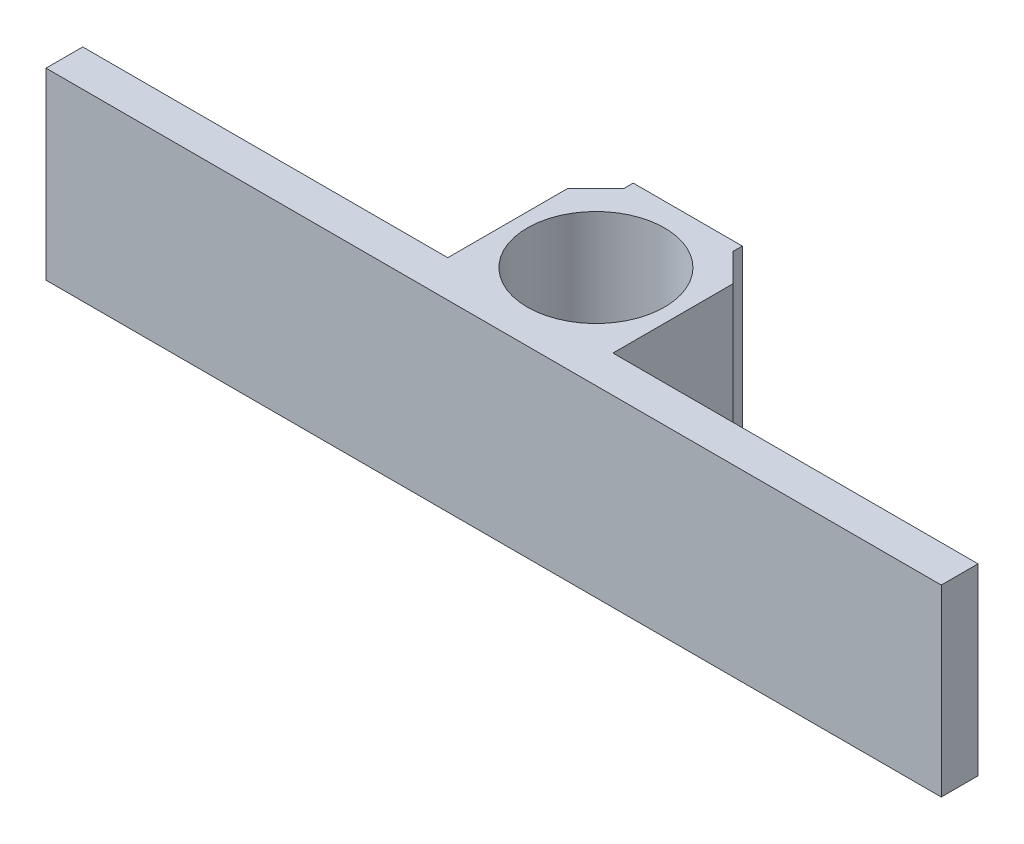
ISO-10303-21;
HEADER;
FILE_DESCRIPTION(('STEP AP214'),'2;1');
FILE_NAME('part.step','',(''),(''),'','','');
FILE_SCHEMA(('AUTOMOTIVE_DESIGN { 1 0 10303 214 1 1 1 1 }'));
ENDSEC;
DATA;
#1=APPLICATION_CONTEXT('core data for automotive mechanical design processes');
#2=APPLICATION_PROTOCOL_DEFINITION('international standard','automotive_design',2000,#1);
#3=PRODUCT_CONTEXT('',#1,'mechanical');
#4=PRODUCT('Part','Part','',(#3));
#5=PRODUCT_RELATED_PRODUCT_CATEGORY('part','',(#4));
#6=PRODUCT_DEFINITION_FORMATION('','',#4);
#7=PRODUCT_DEFINITION_CONTEXT('part definition',#1,'design');
#8=PRODUCT_DEFINITION('design','',#6,#7);
#9=PRODUCT_DEFINITION_SHAPE('','',#8);
#10=(LENGTH_UNIT() NAMED_UNIT(*) SI_UNIT(.MILLI.,.METRE.));
#11=(NAMED_UNIT(*) PLANE_ANGLE_UNIT() SI_UNIT($,.RADIAN.));
#12=(NAMED_UNIT(*) SI_UNIT($,.STERADIAN.) SOLID_ANGLE_UNIT());
#13=UNCERTAINTY_MEASURE_WITH_UNIT(LENGTH_MEASURE(1.E-05),#10,'distance_accuracy_value','');
#14=(GEOMETRIC_REPRESENTATION_CONTEXT(3) GLOBAL_UNCERTAINTY_ASSIGNED_CONTEXT((#13)) GLOBAL_UNIT_ASSIGNED_CONTEXT((#10,
#11,#12)) REPRESENTATION_CONTEXT('',''));
#15=CARTESIAN_POINT('',(0.,0.,0.));
#16=DIRECTION('',(0.,0.,1.));
#17=DIRECTION('',(1.,0.,0.));
#18=AXIS2_PLACEMENT_3D('',#15,#16,#17);
#19=CARTESIAN_POINT('',(0.,0.,0.));
#20=DIRECTION('',(0.,0.,1.));
#21=DIRECTION('',(1.,0.,0.));
#22=AXIS2_PLACEMENT_3D('',#19,#20,#21);
#23=PLANE('',#22);
#24=DIRECTION('',(-1.,0.,0.));
#25=VECTOR('',#24,1.);
#26=CARTESIAN_POINT('',(-151.290601160674,21.7469632794638,0.));
#27=LINE('',#26,#25);
#28=CARTESIAN_POINT('',(-50.3115162557315,21.7469632794638,0.));
#29=VERTEX_POINT('',#28);
#30=CARTESIAN_POINT('',(-151.290601160674,21.7469632794638,0.));
#31=VERTEX_POINT('',#30);
#32=EDGE_CURVE('E397',#29,#31,#27,.T.);
#33=ORIENTED_EDGE('',*,*,#32,.F.);
#34=DIRECTION('',(0.,1.,0.));
#35=VECTOR('',#34,1.);
#36=CARTESIAN_POINT('',(-50.3115162557315,-49.2816636557347,0.));
#37=LINE('',#36,#35);
#38=CARTESIAN_POINT('',(-50.3115162557315,-29.0530367205362,0.));
#39=VERTEX_POINT('',#38);
#40=EDGE_CURVE('E352',#39,#29,#37,.T.);
#41=ORIENTED_EDGE('',*,*,#40,.F.);
#42=DIRECTION('',(1.,0.,0.));
#43=VECTOR('',#42,1.);
#44=CARTESIAN_POINT('',(-151.290601160674,-29.0530367205362,0.));
#45=LINE('',#44,#43);
#46=CARTESIAN_POINT('',(-151.290601160674,-29.0530367205362,0.));
#47=VERTEX_POINT('',#46);
#48=EDGE_CURVE('E392',#47,#39,#45,.T.);
#49=ORIENTED_EDGE('',*,*,#48,.F.);
#50=DIRECTION('',(0.,-1.,0.));
#51=VECTOR('',#50,1.);
#52=CARTESIAN_POINT('',(-151.290601160674,21.7469632794638,0.));
#53=LINE('',#52,#51);
#54=EDGE_CURVE('E375',#31,#47,#53,.T.);
#55=ORIENTED_EDGE('',*,*,#54,.F.);
#56=EDGE_LOOP('',(#33,#41,#49,#55));
#57=FACE_BOUND('',#56,.T.);
#58=ADVANCED_FACE('F36',(#57),#23,.F.);
#59=CARTESIAN_POINT('',(-151.290601160674,21.7469632794638,10.16));
#60=DIRECTION('',(1.,0.,0.));
#61=DIRECTION('',(0.,0.,-1.));
#62=AXIS2_PLACEMENT_3D('',#59,#60,#61);
#63=PLANE('',#62);
#64=ORIENTED_EDGE('',*,*,#54,.T.);
#65=DIRECTION('',(0.,0.,-1.));
#66=VECTOR('',#65,1.);
#67=CARTESIAN_POINT('',(-151.290601160674,-29.0530367205362,10.16));
#68=LINE('',#67,#66);
#69=CARTESIAN_POINT('',(-151.290601160674,-29.0530367205362,10.16));
#70=VERTEX_POINT('',#69);
#71=EDGE_CURVE('E11',#70,#47,#68,.T.);
#72=ORIENTED_EDGE('',*,*,#71,.F.);
#73=DIRECTION('',(0.,-1.,0.));
#74=VECTOR('',#73,1.);
#75=CARTESIAN_POINT('',(-151.290601160674,21.7469632794638,10.16));
#76=LINE('',#75,#74);
#77=CARTESIAN_POINT('',(-151.290601160674,21.7469632794638,10.16));
#78=VERTEX_POINT('',#77);
#79=EDGE_CURVE('E378',#78,#70,#76,.T.);
#80=ORIENTED_EDGE('',*,*,#79,.F.);
#81=DIRECTION('',(0.,0.,-1.));
#82=VECTOR('',#81,1.);
#83=CARTESIAN_POINT('',(-151.290601160674,21.7469632794638,10.16));
#84=LINE('',#83,#82);
#85=EDGE_CURVE('E388',#78,#31,#84,.T.);
#86=ORIENTED_EDGE('',*,*,#85,.T.);
#87=EDGE_LOOP('',(#64,#72,#80,#86));
#88=FACE_BOUND('',#87,.T.);
#89=ADVANCED_FACE('F38',(#88),#63,.F.);
#90=CARTESIAN_POINT('',(-151.290601160674,-29.0530367205362,10.16));
#91=DIRECTION('',(0.,1.,0.));
#92=DIRECTION('',(0.,0.,1.));
#93=AXIS2_PLACEMENT_3D('',#90,#91,#92);
#94=PLANE('',#93);
#95=DIRECTION('',(0.,0.,-1.));
#96=VECTOR('',#95,1.);
#97=CARTESIAN_POINT('',(-50.3115162557315,-29.0530367205362,-18.1384707697632));
#98=LINE('',#97,#96);
#99=CARTESIAN_POINT('',(-50.3115162557315,-29.0530367205362,-33.2069728077245));
#100=VERTEX_POINT('',#99);
#101=EDGE_CURVE('E355',#39,#100,#98,.T.);
#102=ORIENTED_EDGE('',*,*,#101,.T.);
#103=DIRECTION('',(0.707106781186542,0.,-0.707106781186554));
#104=VECTOR('',#103,1.);
#105=CARTESIAN_POINT('',(-42.5327662557315,-29.0530367205362,-40.9857228077247));
#106=LINE('',#105,#104);
#107=CARTESIAN_POINT('',(-42.5327662557315,-29.0530367205362,-40.9857228077247));
#108=VERTEX_POINT('',#107);
#109=EDGE_CURVE('E309',#100,#108,#106,.T.);
#110=ORIENTED_EDGE('',*,*,#109,.T.);
#111=DIRECTION('',(0.,0.,1.));
#112=VECTOR('',#111,1.);
#113=CARTESIAN_POINT('',(-42.5327662557315,-29.0530367205362,-43.5257228077247));
#114=LINE('',#113,#112);
#115=CARTESIAN_POINT('',(-42.5327662557315,-29.0530367205362,-43.5257228077247));
#116=VERTEX_POINT('',#115);
#117=EDGE_CURVE('E334',#116,#108,#114,.T.);
#118=ORIENTED_EDGE('',*,*,#117,.F.);
#119=DIRECTION('',(-1.,0.,0.));
#120=VECTOR('',#119,1.);
#121=CARTESIAN_POINT('',(-42.5327662557315,-29.0530367205362,-43.5257228077247));
#122=LINE('',#121,#120);
#123=CARTESIAN_POINT('',(-12.3702662557315,-29.0530367205362,-43.5257228077247));
#124=VERTEX_POINT('',#123);
#125=EDGE_CURVE('E332',#124,#116,#122,.T.);
#126=ORIENTED_EDGE('',*,*,#125,.F.);
#127=DIRECTION('',(0.,0.,1.));
#128=VECTOR('',#127,1.);
#129=CARTESIAN_POINT('',(-12.3702662557315,-29.0530367205362,-43.5257228077247));
#130=LINE('',#129,#128);
#131=CARTESIAN_POINT('',(-12.3702662557315,-29.0530367205362,-40.9857228077247));
#132=VERTEX_POINT('',#131);
#133=EDGE_CURVE('E341',#124,#132,#130,.T.);
#134=ORIENTED_EDGE('',*,*,#133,.T.);
#135=DIRECTION('',(0.707106781186556,0.,0.707106781186539));
#136=VECTOR('',#135,1.);
#137=CARTESIAN_POINT('',(-12.3702662557315,-29.0530367205362,-40.9857228077247));
#138=LINE('',#137,#136);
#139=CARTESIAN_POINT('',(-4.61701217980854,-29.0530367205362,-33.2324687318019));
#140=VERTEX_POINT('',#139);
#141=EDGE_CURVE('E318',#132,#140,#138,.T.);
#142=ORIENTED_EDGE('',*,*,#141,.T.);
#143=DIRECTION('',(0.,0.,1.));
#144=VECTOR('',#143,1.);
#145=CARTESIAN_POINT('',(-4.61701217980853,-29.0530367205362,-18.1384707697632));
#146=LINE('',#145,#144);
#147=CARTESIAN_POINT('',(-4.61701217980853,-29.0530367205362,0.));
#148=VERTEX_POINT('',#147);
#149=EDGE_CURVE('E359',#140,#148,#146,.T.);
#150=ORIENTED_EDGE('',*,*,#149,.T.);
#151=CARTESIAN_POINT('',(96.359398839326,-29.0530367205362,0.));
#152=VERTEX_POINT('',#151);
#153=EDGE_CURVE('E391',#148,#152,#45,.T.);
#154=ORIENTED_EDGE('',*,*,#153,.T.);
#155=DIRECTION('',(0.,0.,-1.));
#156=VECTOR('',#155,1.);
#157=CARTESIAN_POINT('',(96.359398839326,-29.0530367205362,10.16));
#158=LINE('',#157,#156);
#159=CARTESIAN_POINT('',(96.359398839326,-29.0530367205362,10.16));
#160=VERTEX_POINT('',#159);
#161=EDGE_CURVE('E45',#160,#152,#158,.T.);
#162=ORIENTED_EDGE('',*,*,#161,.F.);
#163=DIRECTION('',(1.,0.,0.));
#164=VECTOR('',#163,1.);
#165=CARTESIAN_POINT('',(-151.290601160674,-29.0530367205362,10.16));
#166=LINE('',#165,#164);
#167=EDGE_CURVE('E381',#70,#160,#166,.T.);
#168=ORIENTED_EDGE('',*,*,#167,.F.);
#169=ORIENTED_EDGE('',*,*,#71,.T.);
#170=ORIENTED_EDGE('',*,*,#48,.T.);
#171=EDGE_LOOP('',(#102,#110,#118,#126,#134,#142,#150,#154,#162,#168,#169,#170));
#172=FACE_BOUND('',#171,.T.);
#173=CARTESIAN_POINT('',(-27.46426421777,-29.0530367205362,-18.1384707697632));
#174=DIRECTION('',(0.,1.,0.));
#175=DIRECTION('',(0.,0.,1.));
#176=AXIS2_PLACEMENT_3D('',#173,#174,#175);
#177=CIRCLE('',#176,7.9375);
#178=CARTESIAN_POINT('',(-27.46426421777,-29.0530367205362,-10.2009707697632));
#179=VERTEX_POINT('',#178);
#180=EDGE_CURVE('E366',#179,#179,#177,.T.);
#181=ORIENTED_EDGE('',*,*,#180,.T.);
#182=EDGE_LOOP('',(#181));
#183=FACE_BOUND('',#182,.T.);
#184=ADVANCED_FACE('F434',(#172,#183),#94,.F.);
#185=CARTESIAN_POINT('',(96.3593988393261,21.7469632794638,10.16));
#186=DIRECTION('',(-1.,0.,0.));
#187=DIRECTION('',(0.,-1.,0.));
#188=AXIS2_PLACEMENT_3D('',#185,#186,#187);
#189=PLANE('',#188);
#190=DIRECTION('',(0.,1.,0.));
#191=VECTOR('',#190,1.);
#192=CARTESIAN_POINT('',(96.3593988393261,21.7469632794638,0.));
#193=LINE('',#192,#191);
#194=CARTESIAN_POINT('',(96.3593988393261,21.7469632794638,0.));
#195=VERTEX_POINT('',#194);
#196=EDGE_CURVE('E395',#152,#195,#193,.T.);
#197=ORIENTED_EDGE('',*,*,#196,.T.);
#198=DIRECTION('',(0.,0.,-1.));
#199=VECTOR('',#198,1.);
#200=CARTESIAN_POINT('',(96.3593988393261,21.7469632794638,10.16));
#201=LINE('',#200,#199);
#202=CARTESIAN_POINT('',(96.3593988393261,21.7469632794638,10.16));
#203=VERTEX_POINT('',#202);
#204=EDGE_CURVE('E402',#203,#195,#201,.T.);
#205=ORIENTED_EDGE('',*,*,#204,.F.);
#206=DIRECTION('',(0.,1.,0.));
#207=VECTOR('',#206,1.);
#208=CARTESIAN_POINT('',(96.3593988393261,21.7469632794638,10.16));
#209=LINE('',#208,#207);
#210=EDGE_CURVE('E384',#160,#203,#209,.T.);
#211=ORIENTED_EDGE('',*,*,#210,.F.);
#212=ORIENTED_EDGE('',*,*,#161,.T.);
#213=EDGE_LOOP('',(#197,#205,#211,#212));
#214=FACE_BOUND('',#213,.T.);
#215=ADVANCED_FACE('F471',(#214),#189,.F.);
#216=CARTESIAN_POINT('',(-151.290601160674,21.7469632794638,10.16));
#217=DIRECTION('',(0.,-1.,0.));
#218=DIRECTION('',(0.,0.,-1.));
#219=AXIS2_PLACEMENT_3D('',#216,#217,#218);
#220=PLANE('',#219);
#221=DIRECTION('',(0.,0.,1.));
#222=VECTOR('',#221,1.);
#223=CARTESIAN_POINT('',(-42.5327662557315,21.7469632794638,-43.5257228077247));
#224=LINE('',#223,#222);
#225=CARTESIAN_POINT('',(-42.5327662557315,21.7469632794638,-43.5257228077247));
#226=VERTEX_POINT('',#225);
#227=CARTESIAN_POINT('',(-42.5327662557315,21.7469632794638,-40.9857228077247));
#228=VERTEX_POINT('',#227);
#229=EDGE_CURVE('E347',#226,#228,#224,.T.);
#230=ORIENTED_EDGE('',*,*,#229,.T.);
#231=DIRECTION('',(0.707106781186542,0.,-0.707106781186554));
#232=VECTOR('',#231,1.);
#233=CARTESIAN_POINT('',(-42.5327662557315,21.7469632794638,-40.9857228077247));
#234=LINE('',#233,#232);
#235=CARTESIAN_POINT('',(-50.3115162557315,21.7469632794638,-33.2069728077245));
#236=VERTEX_POINT('',#235);
#237=EDGE_CURVE('E313',#236,#228,#234,.T.);
#238=ORIENTED_EDGE('',*,*,#237,.F.);
#239=DIRECTION('',(0.,0.,1.));
#240=VECTOR('',#239,1.);
#241=CARTESIAN_POINT('',(-50.3115162557315,21.7469632794638,-18.1384707697632));
#242=LINE('',#241,#240);
#243=EDGE_CURVE('E350',#236,#29,#242,.T.);
#244=ORIENTED_EDGE('',*,*,#243,.T.);
#245=ORIENTED_EDGE('',*,*,#32,.T.);
#246=ORIENTED_EDGE('',*,*,#85,.F.);
#247=DIRECTION('',(-1.,0.,0.));
#248=VECTOR('',#247,1.);
#249=CARTESIAN_POINT('',(-151.290601160674,21.7469632794638,10.16));
#250=LINE('',#249,#248);
#251=EDGE_CURVE('E386',#203,#78,#250,.T.);
#252=ORIENTED_EDGE('',*,*,#251,.F.);
#253=ORIENTED_EDGE('',*,*,#204,.T.);
#254=CARTESIAN_POINT('',(-4.61701217980859,21.7469632794638,0.));
#255=VERTEX_POINT('',#254);
#256=EDGE_CURVE('E382',#195,#255,#27,.T.);
#257=ORIENTED_EDGE('',*,*,#256,.T.);
#258=DIRECTION('',(0.,0.,-1.));
#259=VECTOR('',#258,1.);
#260=CARTESIAN_POINT('',(-4.61701217980853,21.7469632794638,-18.1384707697632));
#261=LINE('',#260,#259);
#262=CARTESIAN_POINT('',(-4.61701217980854,21.7469632794638,-33.2324687318019));
#263=VERTEX_POINT('',#262);
#264=EDGE_CURVE('E358',#255,#263,#261,.T.);
#265=ORIENTED_EDGE('',*,*,#264,.T.);
#266=DIRECTION('',(0.707106781186556,0.,0.707106781186539));
#267=VECTOR('',#266,1.);
#268=CARTESIAN_POINT('',(-12.3702662557315,21.7469632794638,-40.9857228077247));
#269=LINE('',#268,#267);
#270=CARTESIAN_POINT('',(-12.3702662557315,21.7469632794638,-40.9857228077247));
#271=VERTEX_POINT('',#270);
#272=EDGE_CURVE('E308',#271,#263,#269,.T.);
#273=ORIENTED_EDGE('',*,*,#272,.F.);
#274=DIRECTION('',(0.,0.,1.));
#275=VECTOR('',#274,1.);
#276=CARTESIAN_POINT('',(-12.3702662557315,21.7469632794638,-43.5257228077247));
#277=LINE('',#276,#275);
#278=CARTESIAN_POINT('',(-12.3702662557315,21.7469632794638,-43.5257228077247));
#279=VERTEX_POINT('',#278);
#280=EDGE_CURVE('E344',#279,#271,#277,.T.);
#281=ORIENTED_EDGE('',*,*,#280,.F.);
#282=DIRECTION('',(1.,0.,0.));
#283=VECTOR('',#282,1.);
#284=CARTESIAN_POINT('',(-42.5327662557315,21.7469632794638,-43.5257228077247));
#285=LINE('',#284,#283);
#286=EDGE_CURVE('E327',#226,#279,#285,.T.);
#287=ORIENTED_EDGE('',*,*,#286,.F.);
#288=EDGE_LOOP('',(#230,#238,#244,#245,#246,#252,#253,#257,#265,#273,#281,#287));
#289=FACE_BOUND('',#288,.T.);
#290=CARTESIAN_POINT('',(-27.46426421777,21.7469632794638,-18.1384707697632));
#291=DIRECTION('',(0.,1.,0.));
#292=DIRECTION('',(0.,0.,1.));
#293=AXIS2_PLACEMENT_3D('',#290,#291,#292);
#294=CIRCLE('',#293,18.9865);
#295=CARTESIAN_POINT('',(-27.46426421777,21.7469632794638,0.848029230236837));
#296=VERTEX_POINT('',#295);
#297=EDGE_CURVE('E369',#296,#296,#294,.T.);
#298=ORIENTED_EDGE('',*,*,#297,.F.);
#299=EDGE_LOOP('',(#298));
#300=FACE_BOUND('',#299,.T.);
#301=ADVANCED_FACE('F450',(#289,#300),#220,.F.);
#302=CARTESIAN_POINT('',(0.,0.,10.16));
#303=DIRECTION('',(0.,0.,1.));
#304=DIRECTION('',(1.,0.,0.));
#305=AXIS2_PLACEMENT_3D('',#302,#303,#304);
#306=PLANE('',#305);
#307=ORIENTED_EDGE('',*,*,#79,.T.);
#308=ORIENTED_EDGE('',*,*,#167,.T.);
#309=ORIENTED_EDGE('',*,*,#210,.T.);
#310=ORIENTED_EDGE('',*,*,#251,.T.);
#311=EDGE_LOOP('',(#307,#308,#309,#310));
#312=FACE_BOUND('',#311,.T.);
#313=ADVANCED_FACE('F441',(#312),#306,.T.);
#314=ORIENTED_EDGE('',*,*,#153,.F.);
#315=DIRECTION('',(0.,1.,0.));
#316=VECTOR('',#315,1.);
#317=CARTESIAN_POINT('',(-4.61701217980853,-49.2816636557347,0.));
#318=LINE('',#317,#316);
#319=EDGE_CURVE('E362',#148,#255,#318,.T.);
#320=ORIENTED_EDGE('',*,*,#319,.T.);
#321=ORIENTED_EDGE('',*,*,#256,.F.);
#322=ORIENTED_EDGE('',*,*,#196,.F.);
#323=EDGE_LOOP('',(#314,#320,#321,#322));
#324=FACE_BOUND('',#323,.T.);
#325=ADVANCED_FACE('F430',(#324),#23,.F.);
#326=CARTESIAN_POINT('',(-27.46426421777,-23.9730367205362,-18.1384707697632));
#327=DIRECTION('',(0.,1.,0.));
#328=DIRECTION('',(0.,0.,1.));
#329=AXIS2_PLACEMENT_3D('',#326,#327,#328);
#330=CYLINDRICAL_SURFACE('',#329,18.9865);
#331=CARTESIAN_POINT('',(-27.46426421777,-29.0530367205362,-18.1384707697632));
#332=DIRECTION('',(0.612372435695802,-0.5,0.612372435695787));
#333=DIRECTION('',(0.353553390593278,0.866025403784439,0.353553390593269));
#334=AXIS2_PLACEMENT_3D('',#331,#332,#333);
#335=ELLIPSE('',#334,37.973,18.9865);
#336=CARTESIAN_POINT('',(-11.9099281049449,-23.3380367205362,-29.0265289225866));
#337=VERTEX_POINT('',#336);
#338=CARTESIAN_POINT('',(-10.2095216522256,-17.6230367205362,-26.0606574153041));
#339=VERTEX_POINT('',#338);
#340=EDGE_CURVE('E235',#337,#339,#335,.T.);
#341=ORIENTED_EDGE('',*,*,#340,.F.);
#342=CARTESIAN_POINT('',(-27.46426421777,-23.3380367205362,-18.1384707697632));
#343=DIRECTION('',(0.,-1.,0.));
#344=DIRECTION('',(0.,0.,-1.));
#345=AXIS2_PLACEMENT_3D('',#342,#343,#344);
#346=CIRCLE('',#345,18.9865);
#347=CARTESIAN_POINT('',(-16.5762060649469,-23.3380367205362,-33.6928068825885));
#348=VERTEX_POINT('',#347);
#349=EDGE_CURVE('E53',#348,#337,#346,.T.);
#350=ORIENTED_EDGE('',*,*,#349,.F.);
#351=CARTESIAN_POINT('',(-27.46426421777,-29.0530367205362,-18.1384707697632));
#352=DIRECTION('',(-0.612372435695802,-0.5,-0.612372435695787));
#353=DIRECTION('',(-0.353553390593278,0.866025403784439,-0.35355339059327));
#354=AXIS2_PLACEMENT_3D('',#351,#352,#353);
#355=ELLIPSE('',#354,37.973,18.9865);
#356=CARTESIAN_POINT('',(-19.5420775722296,-17.6230367205362,-35.3932133353078));
#357=VERTEX_POINT('',#356);
#358=EDGE_CURVE('E244',#357,#348,#355,.T.);
#359=ORIENTED_EDGE('',*,*,#358,.F.);
#360=CARTESIAN_POINT('',(-27.46426421777,-6.19303672053623,-18.1384707697632));
#361=DIRECTION('',(-0.612372435695802,0.500000000000001,-0.612372435695787));
#362=DIRECTION('',(0.353553390593279,0.866025403784438,0.35355339059327));
#363=AXIS2_PLACEMENT_3D('',#360,#361,#362);
#364=ELLIPSE('',#363,37.9729999999999,18.9865);
#365=CARTESIAN_POINT('',(-16.576206064947,-11.9080367205362,-33.6928068825885));
#366=VERTEX_POINT('',#365);
#367=EDGE_CURVE('E253',#366,#357,#364,.T.);
#368=ORIENTED_EDGE('',*,*,#367,.F.);
#369=CARTESIAN_POINT('',(-27.46426421777,-11.9080367205362,-18.1384707697632));
#370=DIRECTION('',(0.,1.,0.));
#371=DIRECTION('',(-1.,0.,0.));
#372=AXIS2_PLACEMENT_3D('',#369,#370,#371);
#373=CIRCLE('',#372,18.9865);
#374=CARTESIAN_POINT('',(-11.9099281049449,-11.9080367205362,-29.0265289225866));
#375=VERTEX_POINT('',#374);
#376=EDGE_CURVE('E250',#375,#366,#373,.T.);
#377=ORIENTED_EDGE('',*,*,#376,.F.);
#378=CARTESIAN_POINT('',(-27.46426421777,-6.19303672053623,-18.1384707697632));
#379=DIRECTION('',(0.612372435695802,0.5,0.612372435695787));
#380=DIRECTION('',(-0.353553390593278,0.866025403784439,-0.353553390593269));
#381=AXIS2_PLACEMENT_3D('',#378,#379,#380);
#382=ELLIPSE('',#381,37.973,18.9865);
#383=EDGE_CURVE('E247',#339,#375,#382,.T.);
#384=ORIENTED_EDGE('',*,*,#383,.F.);
#385=EDGE_LOOP('',(#341,#350,#359,#368,#377,#384));
#386=FACE_BOUND('',#385,.T.);
#387=CARTESIAN_POINT('',(-27.46426421777,-16.3160260083669,-18.1384707697632));
#388=DIRECTION('',(-0.612372435695802,-0.5,-0.612372435695787));
#389=DIRECTION('',(-0.353553390593278,0.866025403784439,-0.35355339059327));
#390=AXIS2_PLACEMENT_3D('',#387,#388,#389);
#391=ELLIPSE('',#390,37.973,18.9865);
#392=CARTESIAN_POINT('',(-19.5213674677381,-4.9230547143162,-35.3836896279955));
#393=VERTEX_POINT('',#392);
#394=CARTESIAN_POINT('',(-16.5584303947041,-10.6380547143162,-33.6803487410275));
#395=VERTEX_POINT('',#394);
#396=EDGE_CURVE('E288',#393,#395,#391,.T.);
#397=ORIENTED_EDGE('',*,*,#396,.F.);
#398=CARTESIAN_POINT('',(-27.46426421777,6.46991657973448,-18.1384707697632));
#399=DIRECTION('',(-0.612372435695802,0.500000000000001,-0.612372435695787));
#400=DIRECTION('',(0.353553390593279,0.866025403784438,0.35355339059327));
#401=AXIS2_PLACEMENT_3D('',#398,#399,#400);
#402=ELLIPSE('',#401,37.9729999999999,18.9865);
#403=CARTESIAN_POINT('',(-16.5584303947042,0.791945285683771,-33.6803487410275));
#404=VERTEX_POINT('',#403);
#405=EDGE_CURVE('E61',#404,#393,#402,.T.);
#406=ORIENTED_EDGE('',*,*,#405,.F.);
#407=CARTESIAN_POINT('',(-27.46426421777,0.791945285683771,-18.1384707697632));
#408=DIRECTION('',(0.,1.,0.));
#409=DIRECTION('',(0.,0.,1.));
#410=AXIS2_PLACEMENT_3D('',#407,#408,#409);
#411=CIRCLE('',#410,18.9865);
#412=CARTESIAN_POINT('',(-11.897487786083,0.791945285683771,-29.0087354296448));
#413=VERTEX_POINT('',#412);
#414=EDGE_CURVE('E276',#413,#404,#411,.T.);
#415=ORIENTED_EDGE('',*,*,#414,.F.);
#416=CARTESIAN_POINT('',(-27.46426421777,6.54397399163309,-18.1384707697632));
#417=DIRECTION('',(0.612372435695802,0.5,0.612372435695787));
#418=DIRECTION('',(-0.353553390593278,0.866025403784439,-0.35355339059327));
#419=AXIS2_PLACEMENT_3D('',#416,#417,#418);
#420=ELLIPSE('',#419,37.973,18.9865);
#421=CARTESIAN_POINT('',(-10.2000185924204,-4.92305471431623,-26.0399266633055));
#422=VERTEX_POINT('',#421);
#423=EDGE_CURVE('E279',#422,#413,#420,.T.);
#424=ORIENTED_EDGE('',*,*,#423,.F.);
#425=CARTESIAN_POINT('',(-27.46426421777,-16.3900834202655,-18.1384707697632));
#426=DIRECTION('',(0.612372435695802,-0.5,0.612372435695787));
#427=DIRECTION('',(0.353553390593278,0.866025403784439,0.353553390593269));
#428=AXIS2_PLACEMENT_3D('',#425,#426,#427);
#429=ELLIPSE('',#428,37.973,18.9865);
#430=CARTESIAN_POINT('',(-11.8974877860829,-10.6380547143162,-29.0087354296448));
#431=VERTEX_POINT('',#430);
#432=EDGE_CURVE('E282',#431,#422,#429,.T.);
#433=ORIENTED_EDGE('',*,*,#432,.F.);
#434=CARTESIAN_POINT('',(-27.46426421777,-10.6380547143162,-18.1384707697632));
#435=DIRECTION('',(0.,-1.,0.));
#436=DIRECTION('',(0.,0.,-1.));
#437=AXIS2_PLACEMENT_3D('',#434,#435,#436);
#438=CIRCLE('',#437,18.9865);
#439=EDGE_CURVE('E285',#395,#431,#438,.T.);
#440=ORIENTED_EDGE('',*,*,#439,.F.);
#441=EDGE_LOOP('',(#397,#406,#415,#424,#433,#440));
#442=FACE_BOUND('',#441,.T.);
#443=CARTESIAN_POINT('',(-27.46426421777,-23.9730367205362,-18.1384707697632));
#444=DIRECTION('',(0.,1.,0.));
#445=DIRECTION('',(0.,0.,1.));
#446=AXIS2_PLACEMENT_3D('',#443,#444,#445);
#447=CIRCLE('',#446,18.9865);
#448=CARTESIAN_POINT('',(-27.46426421777,-23.9730367205362,0.848029230236837));
#449=VERTEX_POINT('',#448);
#450=EDGE_CURVE('E372',#449,#449,#447,.T.);
#451=ORIENTED_EDGE('',*,*,#450,.F.);
#452=EDGE_LOOP('',(#451));
#453=FACE_BOUND('',#452,.T.);
#454=ORIENTED_EDGE('',*,*,#297,.T.);
#455=EDGE_LOOP('',(#454));
#456=FACE_BOUND('',#455,.T.);
#457=ADVANCED_FACE('F440',(#386,#442,#453,#456),#330,.F.);
#458=CARTESIAN_POINT('',(-27.46426421777,-23.9730367205362,-18.1384707697632));
#459=DIRECTION('',(0.,1.,0.));
#460=DIRECTION('',(0.,0.,1.));
#461=AXIS2_PLACEMENT_3D('',#458,#459,#460);
#462=PLANE('',#461);
#463=CARTESIAN_POINT('',(-27.46426421777,-23.9730367205362,-18.1384707697632));
#464=DIRECTION('',(0.,1.,0.));
#465=DIRECTION('',(0.,0.,1.));
#466=AXIS2_PLACEMENT_3D('',#463,#464,#465);
#467=CIRCLE('',#466,7.9375);
#468=CARTESIAN_POINT('',(-27.46426421777,-23.9730367205362,-10.2009707697632));
#469=VERTEX_POINT('',#468);
#470=EDGE_CURVE('E361',#469,#469,#467,.T.);
#471=ORIENTED_EDGE('',*,*,#470,.F.);
#472=EDGE_LOOP('',(#471));
#473=FACE_BOUND('',#472,.T.);
#474=ORIENTED_EDGE('',*,*,#450,.T.);
#475=EDGE_LOOP('',(#474));
#476=FACE_BOUND('',#475,.T.);
#477=ADVANCED_FACE('F447',(#473,#476),#462,.T.);
#478=CARTESIAN_POINT('',(-27.46426421777,-29.0530367205362,-18.1384707697632));
#479=DIRECTION('',(0.,1.,0.));
#480=DIRECTION('',(0.,0.,1.));
#481=AXIS2_PLACEMENT_3D('',#478,#479,#480);
#482=CYLINDRICAL_SURFACE('',#481,7.9375);
#483=ORIENTED_EDGE('',*,*,#180,.F.);
#484=EDGE_LOOP('',(#483));
#485=FACE_BOUND('',#484,.T.);
#486=ORIENTED_EDGE('',*,*,#470,.T.);
#487=EDGE_LOOP('',(#486));
#488=FACE_BOUND('',#487,.T.);
#489=ADVANCED_FACE('F519',(#485,#488),#482,.F.);
#490=CARTESIAN_POINT('',(-4.61701217980853,-49.2816636557347,-18.1384707697632));
#491=DIRECTION('',(1.,0.,0.));
#492=DIRECTION('',(0.,0.,-1.));
#493=AXIS2_PLACEMENT_3D('',#490,#491,#492);
#494=PLANE('',#493);
#495=DIRECTION('',(0.,1.,0.));
#496=VECTOR('',#495,1.);
#497=CARTESIAN_POINT('',(-4.61701217980854,-29.0530367205362,-33.2324687318019));
#498=LINE('',#497,#496);
#499=EDGE_CURVE('E315',#140,#263,#498,.T.);
#500=ORIENTED_EDGE('',*,*,#499,.T.);
#501=ORIENTED_EDGE('',*,*,#264,.F.);
#502=ORIENTED_EDGE('',*,*,#319,.F.);
#503=ORIENTED_EDGE('',*,*,#149,.F.);
#504=EDGE_LOOP('',(#500,#501,#502,#503));
#505=FACE_BOUND('',#504,.T.);
#506=ADVANCED_FACE('F461',(#505),#494,.T.);
#507=CARTESIAN_POINT('',(-50.3115162557315,-49.2816636557347,-18.1384707697632));
#508=DIRECTION('',(-1.,0.,0.));
#509=DIRECTION('',(0.,0.,1.));
#510=AXIS2_PLACEMENT_3D('',#507,#508,#509);
#511=PLANE('',#510);
#512=DIRECTION('',(0.,1.,0.));
#513=VECTOR('',#512,1.);
#514=CARTESIAN_POINT('',(-50.3115162557315,-29.0530367205362,-33.2069728077245));
#515=LINE('',#514,#513);
#516=EDGE_CURVE('E312',#100,#236,#515,.T.);
#517=ORIENTED_EDGE('',*,*,#516,.F.);
#518=ORIENTED_EDGE('',*,*,#101,.F.);
#519=ORIENTED_EDGE('',*,*,#40,.T.);
#520=ORIENTED_EDGE('',*,*,#243,.F.);
#521=EDGE_LOOP('',(#517,#518,#519,#520));
#522=FACE_BOUND('',#521,.T.);
#523=ADVANCED_FACE('F480',(#522),#511,.T.);
#524=CARTESIAN_POINT('',(-42.5327662557315,21.7469632794638,-43.5257228077247));
#525=DIRECTION('',(1.,0.,0.));
#526=DIRECTION('',(0.,1.,0.));
#527=AXIS2_PLACEMENT_3D('',#524,#525,#526);
#528=PLANE('',#527);
#529=DIRECTION('',(0.,1.,0.));
#530=VECTOR('',#529,1.);
#531=CARTESIAN_POINT('',(-42.5327662557315,21.7469632794638,-40.9857228077247));
#532=LINE('',#531,#530);
#533=EDGE_CURVE('E317',#108,#228,#532,.T.);
#534=ORIENTED_EDGE('',*,*,#533,.T.);
#535=ORIENTED_EDGE('',*,*,#229,.F.);
#536=DIRECTION('',(0.,1.,0.));
#537=VECTOR('',#536,1.);
#538=CARTESIAN_POINT('',(-42.5327662557315,21.7469632794638,-43.5257228077247));
#539=LINE('',#538,#537);
#540=EDGE_CURVE('E324',#116,#226,#539,.T.);
#541=ORIENTED_EDGE('',*,*,#540,.F.);
#542=ORIENTED_EDGE('',*,*,#117,.T.);
#543=EDGE_LOOP('',(#534,#535,#541,#542));
#544=FACE_BOUND('',#543,.T.);
#545=ADVANCED_FACE('F488',(#544),#528,.F.);
#546=CARTESIAN_POINT('',(-12.3702662557315,21.7469632794638,-43.5257228077247));
#547=DIRECTION('',(-1.,0.,0.));
#548=DIRECTION('',(0.,-1.,0.));
#549=AXIS2_PLACEMENT_3D('',#546,#547,#548);
#550=PLANE('',#549);
#551=DIRECTION('',(0.,-1.,0.));
#552=VECTOR('',#551,1.);
#553=CARTESIAN_POINT('',(-12.3702662557315,21.7469632794638,-40.9857228077247));
#554=LINE('',#553,#552);
#555=EDGE_CURVE('E328',#271,#132,#554,.T.);
#556=ORIENTED_EDGE('',*,*,#555,.T.);
#557=ORIENTED_EDGE('',*,*,#133,.F.);
#558=DIRECTION('',(0.,-1.,0.));
#559=VECTOR('',#558,1.);
#560=CARTESIAN_POINT('',(-12.3702662557315,21.7469632794638,-43.5257228077247));
#561=LINE('',#560,#559);
#562=EDGE_CURVE('E330',#279,#124,#561,.T.);
#563=ORIENTED_EDGE('',*,*,#562,.F.);
#564=ORIENTED_EDGE('',*,*,#280,.T.);
#565=EDGE_LOOP('',(#556,#557,#563,#564));
#566=FACE_BOUND('',#565,.T.);
#567=ADVANCED_FACE('F495',(#566),#550,.F.);
#568=CARTESIAN_POINT('',(0.,0.,-43.5257228077247));
#569=DIRECTION('',(0.,0.,1.));
#570=DIRECTION('',(1.,0.,0.));
#571=AXIS2_PLACEMENT_3D('',#568,#569,#570);
#572=PLANE('',#571);
#573=ORIENTED_EDGE('',*,*,#540,.T.);
#574=ORIENTED_EDGE('',*,*,#286,.T.);
#575=ORIENTED_EDGE('',*,*,#562,.T.);
#576=ORIENTED_EDGE('',*,*,#125,.T.);
#577=EDGE_LOOP('',(#573,#574,#575,#576));
#578=FACE_BOUND('',#577,.T.);
#579=ADVANCED_FACE('F492',(#578),#572,.F.);
#580=CARTESIAN_POINT('',(-12.3702662557315,-29.0530367205362,-40.9857228077247));
#581=DIRECTION('',(-0.707106781186539,0.,0.707106781186556));
#582=DIRECTION('',(0.707106781186556,0.,0.707106781186539));
#583=AXIS2_PLACEMENT_3D('',#580,#581,#582);
#584=PLANE('',#583);
#585=CARTESIAN_POINT('',(-8.47852231186831,-4.92305471431622,-37.0939788638616));
#586=DIRECTION('',(0.707106781186539,0.,-0.707106781186556));
#587=DIRECTION('',(-0.707106781186556,0.,-0.707106781186539));
#588=AXIS2_PLACEMENT_3D('',#585,#586,#587);
#589=CIRCLE('',#588,3.3782);
#590=CARTESIAN_POINT('',(-10.8672704400727,-4.92305471431622,-39.4827269920659));
#591=VERTEX_POINT('',#590);
#592=EDGE_CURVE('E302',#591,#591,#589,.T.);
#593=ORIENTED_EDGE('',*,*,#592,.F.);
#594=EDGE_LOOP('',(#593));
#595=FACE_BOUND('',#594,.T.);
#596=CARTESIAN_POINT('',(-8.4936392177702,-17.6230367205362,-37.1090957697634));
#597=DIRECTION('',(0.707106781186539,0.,-0.707106781186556));
#598=DIRECTION('',(-0.707106781186556,0.,-0.707106781186539));
#599=AXIS2_PLACEMENT_3D('',#596,#597,#598);
#600=CIRCLE('',#599,3.3782);
#601=CARTESIAN_POINT('',(-10.8823873459746,-17.6230367205362,-39.4978438979678));
#602=VERTEX_POINT('',#601);
#603=EDGE_CURVE('E305',#602,#602,#600,.T.);
#604=ORIENTED_EDGE('',*,*,#603,.F.);
#605=EDGE_LOOP('',(#604));
#606=FACE_BOUND('',#605,.T.);
#607=ORIENTED_EDGE('',*,*,#272,.T.);
#608=ORIENTED_EDGE('',*,*,#499,.F.);
#609=ORIENTED_EDGE('',*,*,#141,.F.);
#610=ORIENTED_EDGE('',*,*,#555,.F.);
#611=EDGE_LOOP('',(#607,#608,#609,#610));
#612=FACE_BOUND('',#611,.T.);
#613=ADVANCED_FACE('F497',(#595,#606,#612),#584,.F.);
#614=CARTESIAN_POINT('',(-42.5327662557315,-29.0530367205362,-40.9857228077247));
#615=DIRECTION('',(0.707106781186554,0.,0.707106781186542));
#616=DIRECTION('',(0.707106781186542,0.,-0.707106781186554));
#617=AXIS2_PLACEMENT_3D('',#614,#615,#616);
#618=PLANE('',#617);
#619=ORIENTED_EDGE('',*,*,#237,.T.);
#620=ORIENTED_EDGE('',*,*,#533,.F.);
#621=ORIENTED_EDGE('',*,*,#109,.F.);
#622=ORIENTED_EDGE('',*,*,#516,.T.);
#623=EDGE_LOOP('',(#619,#620,#621,#622));
#624=FACE_BOUND('',#623,.T.);
#625=ADVANCED_FACE('F484',(#624),#618,.F.);
#626=CARTESIAN_POINT('',(-8.4936392177702,-17.6230367205362,-37.1090957697634));
#627=DIRECTION('',(0.707106781186539,0.,-0.707106781186556));
#628=DIRECTION('',(-0.707106781186556,0.,-0.707106781186539));
#629=AXIS2_PLACEMENT_3D('',#626,#627,#628);
#630=CYLINDRICAL_SURFACE('',#629,3.3782);
#631=CARTESIAN_POINT('',(-9.95293083744392,-17.6230367205362,-35.6498041500897));
#632=DIRECTION('',(0.707106781186539,0.,-0.707106781186557));
#633=DIRECTION('',(-0.707106781186557,0.,-0.707106781186539));
#634=AXIS2_PLACEMENT_3D('',#631,#632,#633);
#635=CIRCLE('',#634,3.3782);
#636=CARTESIAN_POINT('',(-12.3416789656483,-17.6230367205362,-38.0385522782941));
#637=VERTEX_POINT('',#636);
#638=EDGE_CURVE('E40',#637,#637,#635,.F.);
#639=ORIENTED_EDGE('',*,*,#638,.T.);
#640=EDGE_LOOP('',(#639));
#641=FACE_BOUND('',#640,.T.);
#642=ORIENTED_EDGE('',*,*,#603,.T.);
#643=EDGE_LOOP('',(#642));
#644=FACE_BOUND('',#643,.T.);
#645=ADVANCED_FACE('F412',(#641,#644),#630,.F.);
#646=CARTESIAN_POINT('',(-8.47852231186831,-4.92305471431622,-37.0939788638616));
#647=DIRECTION('',(0.707106781186539,0.,-0.707106781186556));
#648=DIRECTION('',(-0.707106781186556,0.,-0.707106781186539));
#649=AXIS2_PLACEMENT_3D('',#646,#647,#648);
#650=CYLINDRICAL_SURFACE('',#649,3.3782);
#651=CARTESIAN_POINT('',(-9.93781393154204,-4.92305471431622,-35.6346872441878));
#652=DIRECTION('',(0.707106781186539,0.,-0.707106781186556));
#653=DIRECTION('',(-0.707106781186556,0.,-0.707106781186539));
#654=AXIS2_PLACEMENT_3D('',#651,#652,#653);
#655=CIRCLE('',#654,3.3782);
#656=CARTESIAN_POINT('',(-12.3265620597465,-4.92305471431622,-38.0234353723922));
#657=VERTEX_POINT('',#656);
#658=EDGE_CURVE('E206',#657,#657,#655,.F.);
#659=ORIENTED_EDGE('',*,*,#658,.T.);
#660=EDGE_LOOP('',(#659));
#661=FACE_BOUND('',#660,.T.);
#662=ORIENTED_EDGE('',*,*,#592,.T.);
#663=EDGE_LOOP('',(#662));
#664=FACE_BOUND('',#663,.T.);
#665=ADVANCED_FACE('F671',(#661,#664),#650,.F.);
#666=CARTESIAN_POINT('',(12.848436656323,0.,-12.8484366563233));
#667=DIRECTION('',(0.707106781186539,0.,-0.707106781186556));
#668=DIRECTION('',(-0.707106781186556,0.,-0.707106781186539));
#669=AXIS2_PLACEMENT_3D('',#666,#667,#668);
#670=PLANE('',#669);
#671=DIRECTION('',(-0.353553390593279,0.866025403784438,-0.35355339059327));
#672=VECTOR('',#671,1.);
#673=CARTESIAN_POINT('',(-12.270952911543,-10.6380547143162,-37.9678262241887));
#674=LINE('',#673,#672);
#675=CARTESIAN_POINT('',(-12.270952911543,-10.6380547143162,-37.9678262241887));
#676=VERTEX_POINT('',#675);
#677=CARTESIAN_POINT('',(-14.6040918915441,-4.92305471431622,-40.3009652041897));
#678=VERTEX_POINT('',#677);
#679=EDGE_CURVE('E258',#676,#678,#674,.T.);
#680=ORIENTED_EDGE('',*,*,#679,.F.);
#681=DIRECTION('',(-0.707106781186556,0.,-0.707106781186539));
#682=VECTOR('',#681,1.);
#683=CARTESIAN_POINT('',(-7.60467495154103,-10.6380547143162,-33.3015482641869));
#684=LINE('',#683,#682);
#685=CARTESIAN_POINT('',(-7.60467495154103,-10.6380547143162,-33.3015482641869));
#686=VERTEX_POINT('',#685);
#687=EDGE_CURVE('E273',#686,#676,#684,.T.);
#688=ORIENTED_EDGE('',*,*,#687,.F.);
#689=DIRECTION('',(-0.353553390593278,-0.866025403784439,-0.353553390593269));
#690=VECTOR('',#689,1.);
#691=CARTESIAN_POINT('',(-5.27153597154003,-4.92305471431623,-30.9684092841859));
#692=LINE('',#691,#690);
#693=CARTESIAN_POINT('',(-5.27153597154003,-4.92305471431623,-30.9684092841859));
#694=VERTEX_POINT('',#693);
#695=EDGE_CURVE('E270',#694,#686,#692,.T.);
#696=ORIENTED_EDGE('',*,*,#695,.F.);
#697=DIRECTION('',(0.353553390593278,-0.866025403784439,0.353553390593269));
#698=VECTOR('',#697,1.);
#699=CARTESIAN_POINT('',(-7.60467495154103,0.791945285683771,-33.3015482641869));
#700=LINE('',#699,#698);
#701=CARTESIAN_POINT('',(-7.60467495154103,0.791945285683771,-33.3015482641869));
#702=VERTEX_POINT('',#701);
#703=EDGE_CURVE('E267',#702,#694,#700,.T.);
#704=ORIENTED_EDGE('',*,*,#703,.F.);
#705=DIRECTION('',(0.707106781186556,0.,0.707106781186539));
#706=VECTOR('',#705,1.);
#707=CARTESIAN_POINT('',(-12.270952911543,0.791945285683771,-37.9678262241888));
#708=LINE('',#707,#706);
#709=CARTESIAN_POINT('',(-12.270952911543,0.791945285683771,-37.9678262241888));
#710=VERTEX_POINT('',#709);
#711=EDGE_CURVE('E264',#710,#702,#708,.T.);
#712=ORIENTED_EDGE('',*,*,#711,.F.);
#713=DIRECTION('',(0.353553390593279,0.866025403784438,0.35355339059327));
#714=VECTOR('',#713,1.);
#715=CARTESIAN_POINT('',(-14.6040918915441,-4.92305471431622,-40.3009652041897));
#716=LINE('',#715,#714);
#717=EDGE_CURVE('E261',#678,#710,#716,.T.);
#718=ORIENTED_EDGE('',*,*,#717,.F.);
#719=EDGE_LOOP('',(#680,#688,#696,#704,#712,#718));
#720=FACE_BOUND('',#719,.T.);
#721=ORIENTED_EDGE('',*,*,#658,.F.);
#722=EDGE_LOOP('',(#721));
#723=FACE_BOUND('',#722,.T.);
#724=ADVANCED_FACE('F680',(#720,#723),#670,.F.);
#725=CARTESIAN_POINT('',(-108.178829128202,-4.92305471431622,53.2737720324707));
#726=DIRECTION('',(-0.612372435695802,0.500000000000001,-0.612372435695787));
#727=DIRECTION('',(-0.707106781186539,0.,0.707106781186556));
#728=AXIS2_PLACEMENT_3D('',#725,#726,#727);
#729=PLANE('',#728);
#730=ORIENTED_EDGE('',*,*,#405,.T.);
#731=DIRECTION('',(0.707106781186539,0.,-0.707106781186556));
#732=VECTOR('',#731,1.);
#733=CARTESIAN_POINT('',(-108.178829128202,-4.92305471431622,53.2737720324707));
#734=LINE('',#733,#732);
#735=EDGE_CURVE('E291',#393,#678,#734,.T.);
#736=ORIENTED_EDGE('',*,*,#735,.T.);
#737=ORIENTED_EDGE('',*,*,#717,.T.);
#738=DIRECTION('',(0.707106781186539,0.,-0.707106781186556));
#739=VECTOR('',#738,1.);
#740=CARTESIAN_POINT('',(-105.845690148201,0.791945285683771,55.6069110124717));
#741=LINE('',#740,#739);
#742=EDGE_CURVE('E299',#404,#710,#741,.T.);
#743=ORIENTED_EDGE('',*,*,#742,.F.);
#744=EDGE_LOOP('',(#730,#736,#737,#743));
#745=FACE_BOUND('',#744,.T.);
#746=ADVANCED_FACE('F689',(#745),#729,.F.);
#747=CARTESIAN_POINT('',(-105.845690148201,0.791945285683771,55.6069110124717));
#748=DIRECTION('',(0.,1.,0.));
#749=DIRECTION('',(0.,0.,1.));
#750=AXIS2_PLACEMENT_3D('',#747,#748,#749);
#751=PLANE('',#750);
#752=ORIENTED_EDGE('',*,*,#414,.T.);
#753=ORIENTED_EDGE('',*,*,#742,.T.);
#754=ORIENTED_EDGE('',*,*,#711,.T.);
#755=DIRECTION('',(0.707106781186539,0.,-0.707106781186556));
#756=VECTOR('',#755,1.);
#757=CARTESIAN_POINT('',(-101.179412188199,0.791945285683771,60.2731889724736));
#758=LINE('',#757,#756);
#759=EDGE_CURVE('E297',#413,#702,#758,.T.);
#760=ORIENTED_EDGE('',*,*,#759,.F.);
#761=EDGE_LOOP('',(#752,#753,#754,#760));
#762=FACE_BOUND('',#761,.T.);
#763=ADVANCED_FACE('F699',(#762),#751,.F.);
#764=CARTESIAN_POINT('',(-101.179412188199,0.791945285683771,60.2731889724736));
#765=DIRECTION('',(0.612372435695802,0.5,0.612372435695787));
#766=DIRECTION('',(0.707106781186539,0.,-0.707106781186556));
#767=AXIS2_PLACEMENT_3D('',#764,#765,#766);
#768=PLANE('',#767);
#769=ORIENTED_EDGE('',*,*,#423,.T.);
#770=ORIENTED_EDGE('',*,*,#759,.T.);
#771=ORIENTED_EDGE('',*,*,#703,.T.);
#772=DIRECTION('',(0.707106781186539,0.,-0.707106781186556));
#773=VECTOR('',#772,1.);
#774=CARTESIAN_POINT('',(-98.8462732081982,-4.92305471431623,62.6063279524745));
#775=LINE('',#774,#773);
#776=EDGE_CURVE('E295',#422,#694,#775,.T.);
#777=ORIENTED_EDGE('',*,*,#776,.F.);
#778=EDGE_LOOP('',(#769,#770,#771,#777));
#779=FACE_BOUND('',#778,.T.);
#780=ADVANCED_FACE('F708',(#779),#768,.F.);
#781=CARTESIAN_POINT('',(-98.8462732081982,-4.92305471431623,62.6063279524745));
#782=DIRECTION('',(0.612372435695802,-0.5,0.612372435695787));
#783=DIRECTION('',(0.707106781186539,0.,-0.707106781186556));
#784=AXIS2_PLACEMENT_3D('',#781,#782,#783);
#785=PLANE('',#784);
#786=ORIENTED_EDGE('',*,*,#432,.T.);
#787=ORIENTED_EDGE('',*,*,#776,.T.);
#788=ORIENTED_EDGE('',*,*,#695,.T.);
#789=DIRECTION('',(0.707106781186539,0.,-0.707106781186556));
#790=VECTOR('',#789,1.);
#791=CARTESIAN_POINT('',(-101.179412188199,-10.6380547143162,60.2731889724736));
#792=LINE('',#791,#790);
#793=EDGE_CURVE('E293',#431,#686,#792,.T.);
#794=ORIENTED_EDGE('',*,*,#793,.F.);
#795=EDGE_LOOP('',(#786,#787,#788,#794));
#796=FACE_BOUND('',#795,.T.);
#797=ADVANCED_FACE('F718',(#796),#785,.F.);
#798=CARTESIAN_POINT('',(-101.179412188199,-10.6380547143162,60.2731889724736));
#799=DIRECTION('',(0.,-1.,0.));
#800=DIRECTION('',(0.,0.,-1.));
#801=AXIS2_PLACEMENT_3D('',#798,#799,#800);
#802=PLANE('',#801);
#803=ORIENTED_EDGE('',*,*,#439,.T.);
#804=ORIENTED_EDGE('',*,*,#793,.T.);
#805=ORIENTED_EDGE('',*,*,#687,.T.);
#806=DIRECTION('',(0.707106781186539,0.,-0.707106781186556));
#807=VECTOR('',#806,1.);
#808=CARTESIAN_POINT('',(-105.845690148201,-10.6380547143162,55.6069110124717));
#809=LINE('',#808,#807);
#810=EDGE_CURVE('E222',#395,#676,#809,.T.);
#811=ORIENTED_EDGE('',*,*,#810,.F.);
#812=EDGE_LOOP('',(#803,#804,#805,#811));
#813=FACE_BOUND('',#812,.T.);
#814=ADVANCED_FACE('F423',(#813),#802,.F.);
#815=CARTESIAN_POINT('',(-105.845690148201,-10.6380547143162,55.6069110124717));
#816=DIRECTION('',(-0.612372435695802,-0.5,-0.612372435695787));
#817=DIRECTION('',(-0.707106781186539,0.,0.707106781186556));
#818=AXIS2_PLACEMENT_3D('',#815,#816,#817);
#819=PLANE('',#818);
#820=ORIENTED_EDGE('',*,*,#396,.T.);
#821=ORIENTED_EDGE('',*,*,#810,.T.);
#822=ORIENTED_EDGE('',*,*,#679,.T.);
#823=ORIENTED_EDGE('',*,*,#735,.F.);
#824=EDGE_LOOP('',(#820,#821,#822,#823));
#825=FACE_BOUND('',#824,.T.);
#826=ADVANCED_FACE('F415',(#825),#819,.F.);
#827=CARTESIAN_POINT('',(12.848436656323,0.,-12.8484366563233));
#828=DIRECTION('',(0.707106781186539,0.,-0.707106781186557));
#829=DIRECTION('',(-0.707106781186557,0.,-0.707106781186539));
#830=AXIS2_PLACEMENT_3D('',#827,#828,#829);
#831=PLANE('',#830);
#832=DIRECTION('',(-0.353553390593278,-0.866025403784439,-0.353553390593269));
#833=VECTOR('',#832,1.);
#834=CARTESIAN_POINT('',(-5.28665287744192,-17.6230367205362,-30.9835261900878));
#835=LINE('',#834,#833);
#836=CARTESIAN_POINT('',(-5.28665287744192,-17.6230367205362,-30.9835261900878));
#837=VERTEX_POINT('',#836);
#838=CARTESIAN_POINT('',(-7.61979185744292,-23.3380367205362,-33.3166651700887));
#839=VERTEX_POINT('',#838);
#840=EDGE_CURVE('E214',#837,#839,#835,.T.);
#841=ORIENTED_EDGE('',*,*,#840,.F.);
#842=DIRECTION('',(0.353553390593278,-0.866025403784439,0.353553390593269));
#843=VECTOR('',#842,1.);
#844=CARTESIAN_POINT('',(-7.61979185744293,-11.9080367205362,-33.3166651700887));
#845=LINE('',#844,#843);
#846=CARTESIAN_POINT('',(-7.61979185744293,-11.9080367205362,-33.3166651700887));
#847=VERTEX_POINT('',#846);
#848=EDGE_CURVE('E232',#847,#837,#845,.T.);
#849=ORIENTED_EDGE('',*,*,#848,.F.);
#850=DIRECTION('',(0.707106781186556,0.,0.707106781186539));
#851=VECTOR('',#850,1.);
#852=CARTESIAN_POINT('',(-12.2860698174449,-11.9080367205362,-37.9829431300906));
#853=LINE('',#852,#851);
#854=CARTESIAN_POINT('',(-12.2860698174449,-11.9080367205362,-37.9829431300906));
#855=VERTEX_POINT('',#854);
#856=EDGE_CURVE('E229',#855,#847,#853,.T.);
#857=ORIENTED_EDGE('',*,*,#856,.F.);
#858=DIRECTION('',(0.353553390593279,0.866025403784438,0.35355339059327));
#859=VECTOR('',#858,1.);
#860=CARTESIAN_POINT('',(-14.6192087974459,-17.6230367205362,-40.3160821100916));
#861=LINE('',#860,#859);
#862=CARTESIAN_POINT('',(-14.6192087974459,-17.6230367205362,-40.3160821100916));
#863=VERTEX_POINT('',#862);
#864=EDGE_CURVE('E226',#863,#855,#861,.T.);
#865=ORIENTED_EDGE('',*,*,#864,.F.);
#866=DIRECTION('',(-0.353553390593278,0.866025403784438,-0.353553390593269));
#867=VECTOR('',#866,1.);
#868=CARTESIAN_POINT('',(-12.2860698174449,-23.3380367205362,-37.9829431300906));
#869=LINE('',#868,#867);
#870=CARTESIAN_POINT('',(-12.2860698174449,-23.3380367205362,-37.9829431300906));
#871=VERTEX_POINT('',#870);
#872=EDGE_CURVE('E217',#871,#863,#869,.T.);
#873=ORIENTED_EDGE('',*,*,#872,.F.);
#874=DIRECTION('',(-0.707106781186556,0.,-0.707106781186539));
#875=VECTOR('',#874,1.);
#876=CARTESIAN_POINT('',(-7.61979185744292,-23.3380367205362,-33.3166651700887));
#877=LINE('',#876,#875);
#878=EDGE_CURVE('E200',#839,#871,#877,.T.);
#879=ORIENTED_EDGE('',*,*,#878,.F.);
#880=EDGE_LOOP('',(#841,#849,#857,#865,#873,#879));
#881=FACE_BOUND('',#880,.T.);
#882=ORIENTED_EDGE('',*,*,#638,.F.);
#883=EDGE_LOOP('',(#882));
#884=FACE_BOUND('',#883,.T.);
#885=ADVANCED_FACE('F211',(#881,#884),#831,.F.);
#886=CARTESIAN_POINT('',(-101.194529094101,-23.3380367205362,60.2580720665717));
#887=DIRECTION('',(0.,-1.,0.));
#888=DIRECTION('',(0.,0.,-1.));
#889=AXIS2_PLACEMENT_3D('',#886,#887,#888);
#890=PLANE('',#889);
#891=ORIENTED_EDGE('',*,*,#349,.T.);
#892=DIRECTION('',(0.707106781186539,0.,-0.707106781186556));
#893=VECTOR('',#892,1.);
#894=CARTESIAN_POINT('',(-101.194529094101,-23.3380367205362,60.2580720665717));
#895=LINE('',#894,#893);
#896=EDGE_CURVE('E197',#337,#839,#895,.T.);
#897=ORIENTED_EDGE('',*,*,#896,.T.);
#898=ORIENTED_EDGE('',*,*,#878,.T.);
#899=DIRECTION('',(0.707106781186539,0.,-0.707106781186556));
#900=VECTOR('',#899,1.);
#901=CARTESIAN_POINT('',(-105.860807054103,-23.3380367205362,55.5917941065698));
#902=LINE('',#901,#900);
#903=EDGE_CURVE('E243',#348,#871,#902,.T.);
#904=ORIENTED_EDGE('',*,*,#903,.F.);
#905=EDGE_LOOP('',(#891,#897,#898,#904));
#906=FACE_BOUND('',#905,.T.);
#907=ADVANCED_FACE('F199',(#906),#890,.F.);
#908=CARTESIAN_POINT('',(-105.860807054103,-23.3380367205362,55.5917941065698));
#909=DIRECTION('',(-0.612372435695802,-0.5,-0.612372435695787));
#910=DIRECTION('',(-0.707106781186539,0.,0.707106781186556));
#911=AXIS2_PLACEMENT_3D('',#908,#909,#910);
#912=PLANE('',#911);
#913=ORIENTED_EDGE('',*,*,#358,.T.);
#914=ORIENTED_EDGE('',*,*,#903,.T.);
#915=ORIENTED_EDGE('',*,*,#872,.T.);
#916=DIRECTION('',(0.707106781186539,0.,-0.707106781186556));
#917=VECTOR('',#916,1.);
#918=CARTESIAN_POINT('',(-108.193946034104,-17.6230367205362,53.2586551265688));
#919=LINE('',#918,#917);
#920=EDGE_CURVE('E241',#357,#863,#919,.T.);
#921=ORIENTED_EDGE('',*,*,#920,.F.);
#922=EDGE_LOOP('',(#913,#914,#915,#921));
#923=FACE_BOUND('',#922,.T.);
#924=ADVANCED_FACE('F421',(#923),#912,.F.);
#925=CARTESIAN_POINT('',(-108.193946034104,-17.6230367205362,53.2586551265688));
#926=DIRECTION('',(-0.612372435695802,0.500000000000001,-0.612372435695787));
#927=DIRECTION('',(-0.707106781186539,0.,0.707106781186556));
#928=AXIS2_PLACEMENT_3D('',#925,#926,#927);
#929=PLANE('',#928);
#930=ORIENTED_EDGE('',*,*,#367,.T.);
#931=ORIENTED_EDGE('',*,*,#920,.T.);
#932=ORIENTED_EDGE('',*,*,#864,.T.);
#933=DIRECTION('',(0.707106781186539,0.,-0.707106781186556));
#934=VECTOR('',#933,1.);
#935=CARTESIAN_POINT('',(-105.860807054103,-11.9080367205362,55.5917941065698));
#936=LINE('',#935,#934);
#937=EDGE_CURVE('E239',#366,#855,#936,.T.);
#938=ORIENTED_EDGE('',*,*,#937,.F.);
#939=EDGE_LOOP('',(#930,#931,#932,#938));
#940=FACE_BOUND('',#939,.T.);
#941=ADVANCED_FACE('F762',(#940),#929,.F.);
#942=CARTESIAN_POINT('',(-105.860807054103,-11.9080367205362,55.5917941065698));
#943=DIRECTION('',(0.,1.,0.));
#944=DIRECTION('',(-1.,0.,0.));
#945=AXIS2_PLACEMENT_3D('',#942,#943,#944);
#946=PLANE('',#945);
#947=ORIENTED_EDGE('',*,*,#376,.T.);
#948=ORIENTED_EDGE('',*,*,#937,.T.);
#949=ORIENTED_EDGE('',*,*,#856,.T.);
#950=DIRECTION('',(0.707106781186539,0.,-0.707106781186556));
#951=VECTOR('',#950,1.);
#952=CARTESIAN_POINT('',(-101.194529094101,-11.9080367205362,60.2580720665717));
#953=LINE('',#952,#951);
#954=EDGE_CURVE('E237',#375,#847,#953,.T.);
#955=ORIENTED_EDGE('',*,*,#954,.F.);
#956=EDGE_LOOP('',(#947,#948,#949,#955));
#957=FACE_BOUND('',#956,.T.);
#958=ADVANCED_FACE('F772',(#957),#946,.F.);
#959=CARTESIAN_POINT('',(-101.194529094101,-11.9080367205362,60.2580720665717));
#960=DIRECTION('',(0.612372435695802,0.5,0.612372435695787));
#961=DIRECTION('',(0.707106781186539,0.,-0.707106781186556));
#962=AXIS2_PLACEMENT_3D('',#959,#960,#961);
#963=PLANE('',#962);
#964=ORIENTED_EDGE('',*,*,#383,.T.);
#965=ORIENTED_EDGE('',*,*,#954,.T.);
#966=ORIENTED_EDGE('',*,*,#848,.T.);
#967=DIRECTION('',(0.707106781186539,0.,-0.707106781186556));
#968=VECTOR('',#967,1.);
#969=CARTESIAN_POINT('',(-98.8613901141001,-17.6230367205362,62.5912110465726));
#970=LINE('',#969,#968);
#971=EDGE_CURVE('E207',#339,#837,#970,.T.);
#972=ORIENTED_EDGE('',*,*,#971,.F.);
#973=EDGE_LOOP('',(#964,#965,#966,#972));
#974=FACE_BOUND('',#973,.T.);
#975=ADVANCED_FACE('F782',(#974),#963,.F.);
#976=CARTESIAN_POINT('',(-98.8613901141001,-17.6230367205362,62.5912110465726));
#977=DIRECTION('',(0.612372435695802,-0.5,0.612372435695787));
#978=DIRECTION('',(0.707106781186539,0.,-0.707106781186556));
#979=AXIS2_PLACEMENT_3D('',#976,#977,#978);
#980=PLANE('',#979);
#981=ORIENTED_EDGE('',*,*,#340,.T.);
#982=ORIENTED_EDGE('',*,*,#971,.T.);
#983=ORIENTED_EDGE('',*,*,#840,.T.);
#984=ORIENTED_EDGE('',*,*,#896,.F.);
#985=EDGE_LOOP('',(#981,#982,#983,#984));
#986=FACE_BOUND('',#985,.T.);
#987=ADVANCED_FACE('F219',(#986),#980,.F.);
#988=CLOSED_SHELL('',(#58,#89,#184,#215,#301,#313,#325,#457,#477,#489,#506,#523,#545,#567,#579,
#613,#625,#645,#665,#724,#746,#763,#780,#797,#814,#826,#885,#907,#924,#941,#958,#975,#987));
#989=MANIFOLD_SOLID_BREP('B2',#988);
#990=ADVANCED_BREP_SHAPE_REPRESENTATION('',(#18,#989),#14);
#991=SHAPE_DEFINITION_REPRESENTATION(#9,#990);
ENDSEC;
END-ISO-10303-21;
